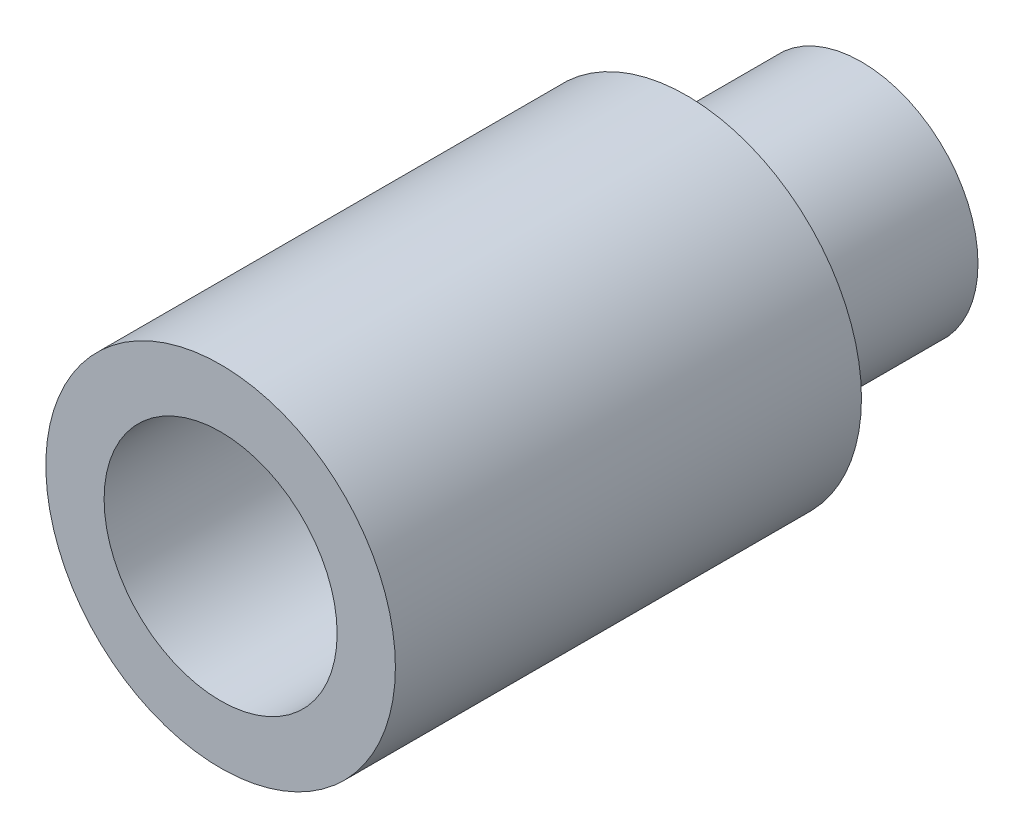
ISO-10303-21;
HEADER;
FILE_DESCRIPTION(('STEP AP214'),'2;1');
FILE_NAME('part.step','',(''),(''),'','','');
FILE_SCHEMA(('AUTOMOTIVE_DESIGN { 1 0 10303 214 1 1 1 1 }'));
ENDSEC;
DATA;
#1=APPLICATION_CONTEXT('core data for automotive mechanical design processes');
#2=APPLICATION_PROTOCOL_DEFINITION('international standard','automotive_design',2000,#1);
#3=PRODUCT_CONTEXT('',#1,'mechanical');
#4=PRODUCT('Part','Part','',(#3));
#5=PRODUCT_RELATED_PRODUCT_CATEGORY('part','',(#4));
#6=PRODUCT_DEFINITION_FORMATION('','',#4);
#7=PRODUCT_DEFINITION_CONTEXT('part definition',#1,'design');
#8=PRODUCT_DEFINITION('design','',#6,#7);
#9=PRODUCT_DEFINITION_SHAPE('','',#8);
#10=(LENGTH_UNIT() NAMED_UNIT(*) SI_UNIT(.MILLI.,.METRE.));
#11=(NAMED_UNIT(*) PLANE_ANGLE_UNIT() SI_UNIT($,.RADIAN.));
#12=(NAMED_UNIT(*) SI_UNIT($,.STERADIAN.) SOLID_ANGLE_UNIT());
#13=UNCERTAINTY_MEASURE_WITH_UNIT(LENGTH_MEASURE(1.E-05),#10,'distance_accuracy_value','');
#14=(GEOMETRIC_REPRESENTATION_CONTEXT(3) GLOBAL_UNCERTAINTY_ASSIGNED_CONTEXT((#13)) GLOBAL_UNIT_ASSIGNED_CONTEXT((#10,
#11,#12)) REPRESENTATION_CONTEXT('',''));
#15=CARTESIAN_POINT('',(0.,0.,0.));
#16=DIRECTION('',(0.,0.,1.));
#17=DIRECTION('',(1.,0.,0.));
#18=AXIS2_PLACEMENT_3D('',#15,#16,#17);
#19=CARTESIAN_POINT('',(0.,0.,9.525));
#20=DIRECTION('',(0.,0.,-1.));
#21=DIRECTION('',(-1.,0.,0.));
#22=AXIS2_PLACEMENT_3D('',#19,#20,#21);
#23=CYLINDRICAL_SURFACE('',#22,6.35);
#24=CARTESIAN_POINT('',(0.,0.,9.525));
#25=DIRECTION('',(0.,0.,1.));
#26=DIRECTION('',(1.,0.,0.));
#27=AXIS2_PLACEMENT_3D('',#24,#25,#26);
#28=CIRCLE('',#27,6.35);
#29=CARTESIAN_POINT('',(-6.35,0.,9.525));
#30=VERTEX_POINT('',#29);
#31=EDGE_CURVE('E10',#30,#30,#28,.T.);
#32=CARTESIAN_POINT('',(0.,0.,0.));
#33=DIRECTION('',(0.,0.,1.));
#34=DIRECTION('',(1.,0.,0.));
#35=AXIS2_PLACEMENT_3D('',#32,#33,#34);
#36=CIRCLE('',#35,6.35);
#37=CARTESIAN_POINT('',(-6.35,0.,0.));
#38=VERTEX_POINT('',#37);
#39=EDGE_CURVE('E34',#38,#38,#36,.T.);
#40=CARTESIAN_POINT('',(-6.35,0.,9.525));
#41=CARTESIAN_POINT('',(-6.35,0.,9.42578125));
#42=CARTESIAN_POINT('',(-6.35,0.,9.3265625));
#43=CARTESIAN_POINT('',(-6.35,0.,9.128125));
#44=CARTESIAN_POINT('',(-6.35,0.,9.02890625));
#45=CARTESIAN_POINT('',(-6.35,0.,8.83046875));
#46=CARTESIAN_POINT('',(-6.35,0.,8.73125));
#47=CARTESIAN_POINT('',(-6.35,0.,8.5328125));
#48=CARTESIAN_POINT('',(-6.35,0.,8.43359375));
#49=CARTESIAN_POINT('',(-6.35,0.,8.23515625));
#50=CARTESIAN_POINT('',(-6.35,0.,8.1359375));
#51=CARTESIAN_POINT('',(-6.35,0.,7.9375));
#52=CARTESIAN_POINT('',(-6.35,0.,7.83828125));
#53=CARTESIAN_POINT('',(-6.35,0.,7.63984375));
#54=CARTESIAN_POINT('',(-6.35,0.,7.540625));
#55=CARTESIAN_POINT('',(-6.35,0.,7.3421875));
#56=CARTESIAN_POINT('',(-6.35,0.,7.24296875));
#57=CARTESIAN_POINT('',(-6.35,0.,7.04453125));
#58=CARTESIAN_POINT('',(-6.35,0.,6.9453125));
#59=CARTESIAN_POINT('',(-6.35,0.,6.746875));
#60=CARTESIAN_POINT('',(-6.35,0.,6.64765625));
#61=CARTESIAN_POINT('',(-6.35,0.,6.44921875));
#62=CARTESIAN_POINT('',(-6.35,0.,6.35));
#63=CARTESIAN_POINT('',(-6.35,0.,6.1515625));
#64=CARTESIAN_POINT('',(-6.35,0.,6.05234375));
#65=CARTESIAN_POINT('',(-6.35,0.,5.85390625));
#66=CARTESIAN_POINT('',(-6.35,0.,5.7546875));
#67=CARTESIAN_POINT('',(-6.35,0.,5.55625));
#68=CARTESIAN_POINT('',(-6.35,0.,5.45703125));
#69=CARTESIAN_POINT('',(-6.35,0.,5.25859375));
#70=CARTESIAN_POINT('',(-6.35,0.,5.159375));
#71=CARTESIAN_POINT('',(-6.35,0.,4.9609375));
#72=CARTESIAN_POINT('',(-6.35,0.,4.86171875));
#73=CARTESIAN_POINT('',(-6.35,0.,4.66328125));
#74=CARTESIAN_POINT('',(-6.35,0.,4.5640625));
#75=CARTESIAN_POINT('',(-6.35,0.,4.365625));
#76=CARTESIAN_POINT('',(-6.35,0.,4.26640625));
#77=CARTESIAN_POINT('',(-6.35,0.,4.06796875));
#78=CARTESIAN_POINT('',(-6.35,0.,3.96875));
#79=CARTESIAN_POINT('',(-6.35,0.,3.7703125));
#80=CARTESIAN_POINT('',(-6.35,0.,3.67109375));
#81=CARTESIAN_POINT('',(-6.35,0.,3.47265625));
#82=CARTESIAN_POINT('',(-6.35,0.,3.3734375));
#83=CARTESIAN_POINT('',(-6.35,0.,3.175));
#84=CARTESIAN_POINT('',(-6.35,0.,3.07578125));
#85=CARTESIAN_POINT('',(-6.35,0.,2.87734375));
#86=CARTESIAN_POINT('',(-6.35,0.,2.778125));
#87=CARTESIAN_POINT('',(-6.35,0.,2.5796875));
#88=CARTESIAN_POINT('',(-6.35,0.,2.48046875));
#89=CARTESIAN_POINT('',(-6.35,0.,2.28203125));
#90=CARTESIAN_POINT('',(-6.35,0.,2.1828125));
#91=CARTESIAN_POINT('',(-6.35,0.,1.984375));
#92=CARTESIAN_POINT('',(-6.35,0.,1.88515625));
#93=CARTESIAN_POINT('',(-6.35,0.,1.68671875));
#94=CARTESIAN_POINT('',(-6.35,0.,1.5875));
#95=CARTESIAN_POINT('',(-6.35,0.,1.3890625));
#96=CARTESIAN_POINT('',(-6.35,0.,1.28984375));
#97=CARTESIAN_POINT('',(-6.35,0.,1.09140625));
#98=CARTESIAN_POINT('',(-6.35,0.,0.992187500000001));
#99=CARTESIAN_POINT('',(-6.35,0.,0.793750000000001));
#100=CARTESIAN_POINT('',(-6.35,0.,0.69453125));
#101=CARTESIAN_POINT('',(-6.35,0.,0.49609375));
#102=CARTESIAN_POINT('',(-6.35,0.,0.396875));
#103=CARTESIAN_POINT('',(-6.35,0.,0.1984375));
#104=CARTESIAN_POINT('',(-6.35,0.,0.0992187500000001));
#105=CARTESIAN_POINT('',(-6.35,0.,0.));
#106=B_SPLINE_CURVE_WITH_KNOTS('',3,(#40,#41,#42,#43,#44,#45,#46,#47,#48,#49,#50,#51,#52,#53,
#54,#55,#56,#57,#58,#59,#60,#61,#62,#63,#64,#65,#66,#67,#68,#69,#70,#71,#72,#73,#74,#75,#76,#77,
#78,#79,#80,#81,#82,#83,#84,#85,#86,#87,#88,#89,#90,#91,#92,#93,#94,#95,#96,#97,#98,#99,#100,
#101,#102,#103,#104,#105),.UNSPECIFIED.,.F.,.F.,(4,2,2,2,2,2,2,2,2,2,2,2,2,2,2,2,2,2,2,2,2,2,2,
2,2,2,2,2,2,2,2,2,4),(0.,0.297656249999998,0.595312499999999,0.892968749999999,1.190625,
1.48828125,1.7859375,2.08359375,2.38125,2.67890625,2.9765625,3.27421875,3.571875,3.86953125,
4.1671875,4.46484375,4.7625,5.06015625,5.3578125,5.65546875,5.953125,6.25078125,6.5484375,
6.84609375,7.14375,7.44140625,7.7390625,8.03671875,8.334375,8.63203125,8.9296875,9.22734375,
9.525),.UNSPECIFIED.);
#107=EDGE_CURVE('BSEAM31',#30,#38,#106,.T.);
#108=ORIENTED_EDGE('',*,*,#31,.F.);
#109=ORIENTED_EDGE('',*,*,#39,.T.);
#110=ORIENTED_EDGE('',*,*,#107,.T.);
#111=ORIENTED_EDGE('',*,*,#107,.F.);
#112=EDGE_LOOP('',(#108,#110,#109,#111));
#113=FACE_BOUND('',#112,.T.);
#114=ADVANCED_FACE('F31',(#113),#23,.T.);
#115=CARTESIAN_POINT('',(0.,0.,0.));
#116=DIRECTION('',(0.,0.,1.));
#117=DIRECTION('',(1.,0.,0.));
#118=AXIS2_PLACEMENT_3D('',#115,#116,#117);
#119=PLANE('',#118);
#120=ORIENTED_EDGE('',*,*,#39,.F.);
#121=EDGE_LOOP('',(#120));
#122=FACE_BOUND('',#121,.T.);
#123=ADVANCED_FACE('F73',(#122),#119,.F.);
#124=CARTESIAN_POINT('',(0.,0.,34.925));
#125=DIRECTION('',(0.,0.,-1.));
#126=DIRECTION('',(-1.,0.,0.));
#127=AXIS2_PLACEMENT_3D('',#124,#125,#126);
#128=CYLINDRICAL_SURFACE('',#127,9.525);
#129=CARTESIAN_POINT('',(0.,0.,34.925));
#130=DIRECTION('',(0.,0.,1.));
#131=DIRECTION('',(1.,0.,0.));
#132=AXIS2_PLACEMENT_3D('',#129,#130,#131);
#133=CIRCLE('',#132,9.525);
#134=CARTESIAN_POINT('',(9.525,0.,34.925));
#135=VERTEX_POINT('',#134);
#136=EDGE_CURVE('E41',#135,#135,#133,.T.);
#137=ORIENTED_EDGE('',*,*,#136,.F.);
#138=EDGE_LOOP('',(#137));
#139=FACE_BOUND('',#138,.T.);
#140=CARTESIAN_POINT('',(0.,0.,9.525));
#141=DIRECTION('',(0.,0.,1.));
#142=DIRECTION('',(1.,0.,0.));
#143=AXIS2_PLACEMENT_3D('',#140,#141,#142);
#144=CIRCLE('',#143,9.525);
#145=CARTESIAN_POINT('',(9.525,0.,9.525));
#146=VERTEX_POINT('',#145);
#147=EDGE_CURVE('E43',#146,#146,#144,.T.);
#148=ORIENTED_EDGE('',*,*,#147,.T.);
#149=EDGE_LOOP('',(#148));
#150=FACE_BOUND('',#149,.T.);
#151=ADVANCED_FACE('F67',(#139,#150),#128,.T.);
#152=CARTESIAN_POINT('',(0.,0.,34.925));
#153=DIRECTION('',(0.,0.,1.));
#154=DIRECTION('',(1.,0.,0.));
#155=AXIS2_PLACEMENT_3D('',#152,#153,#154);
#156=PLANE('',#155);
#157=CARTESIAN_POINT('',(0.,0.,34.925));
#158=DIRECTION('',(0.,0.,1.));
#159=DIRECTION('',(1.,0.,0.));
#160=AXIS2_PLACEMENT_3D('',#157,#158,#159);
#161=CIRCLE('',#160,6.35);
#162=CARTESIAN_POINT('',(6.35,0.,34.925));
#163=VERTEX_POINT('',#162);
#164=EDGE_CURVE('E49',#163,#163,#161,.T.);
#165=ORIENTED_EDGE('',*,*,#164,.F.);
#166=EDGE_LOOP('',(#165));
#167=FACE_BOUND('',#166,.T.);
#168=ORIENTED_EDGE('',*,*,#136,.T.);
#169=EDGE_LOOP('',(#168));
#170=FACE_BOUND('',#169,.T.);
#171=ADVANCED_FACE('F64',(#167,#170),#156,.T.);
#172=CARTESIAN_POINT('',(0.,0.,9.525));
#173=DIRECTION('',(0.,0.,1.));
#174=DIRECTION('',(1.,0.,0.));
#175=AXIS2_PLACEMENT_3D('',#172,#173,#174);
#176=PLANE('',#175);
#177=ORIENTED_EDGE('',*,*,#31,.T.);
#178=EDGE_LOOP('',(#177));
#179=FACE_BOUND('',#178,.T.);
#180=ORIENTED_EDGE('',*,*,#147,.F.);
#181=EDGE_LOOP('',(#180));
#182=FACE_BOUND('',#181,.T.);
#183=ADVANCED_FACE('F60',(#179,#182),#176,.F.);
#184=CARTESIAN_POINT('',(0.,0.,15.875));
#185=DIRECTION('',(0.,0.,1.));
#186=DIRECTION('',(1.,0.,0.));
#187=AXIS2_PLACEMENT_3D('',#184,#185,#186);
#188=CYLINDRICAL_SURFACE('',#187,6.35);
#189=CARTESIAN_POINT('',(0.,0.,15.875));
#190=DIRECTION('',(0.,0.,1.));
#191=DIRECTION('',(1.,0.,0.));
#192=AXIS2_PLACEMENT_3D('',#189,#190,#191);
#193=CIRCLE('',#192,6.35);
#194=CARTESIAN_POINT('',(6.35,0.,15.875));
#195=VERTEX_POINT('',#194);
#196=EDGE_CURVE('E46',#195,#195,#193,.T.);
#197=CARTESIAN_POINT('',(6.35,0.,15.875));
#198=CARTESIAN_POINT('',(6.35,0.,16.0734375));
#199=CARTESIAN_POINT('',(6.35,0.,16.271875));
#200=CARTESIAN_POINT('',(6.35,0.,16.66875));
#201=CARTESIAN_POINT('',(6.35,0.,16.8671875));
#202=CARTESIAN_POINT('',(6.35,0.,17.2640625));
#203=CARTESIAN_POINT('',(6.35,0.,17.4625));
#204=CARTESIAN_POINT('',(6.35,0.,17.859375));
#205=CARTESIAN_POINT('',(6.35,0.,18.0578125));
#206=CARTESIAN_POINT('',(6.35,0.,18.4546875));
#207=CARTESIAN_POINT('',(6.35,0.,18.653125));
#208=CARTESIAN_POINT('',(6.35,0.,19.05));
#209=CARTESIAN_POINT('',(6.35,0.,19.2484375));
#210=CARTESIAN_POINT('',(6.35,0.,19.6453125));
#211=CARTESIAN_POINT('',(6.35,0.,19.84375));
#212=CARTESIAN_POINT('',(6.35,0.,20.240625));
#213=CARTESIAN_POINT('',(6.35,0.,20.4390625));
#214=CARTESIAN_POINT('',(6.35,0.,20.8359375));
#215=CARTESIAN_POINT('',(6.35,0.,21.034375));
#216=CARTESIAN_POINT('',(6.35,0.,21.43125));
#217=CARTESIAN_POINT('',(6.35,0.,21.6296875));
#218=CARTESIAN_POINT('',(6.35,0.,22.0265625));
#219=CARTESIAN_POINT('',(6.35,0.,22.225));
#220=CARTESIAN_POINT('',(6.35,0.,22.621875));
#221=CARTESIAN_POINT('',(6.35,0.,22.8203125));
#222=CARTESIAN_POINT('',(6.35,0.,23.2171875));
#223=CARTESIAN_POINT('',(6.35,0.,23.415625));
#224=CARTESIAN_POINT('',(6.35,0.,23.8125));
#225=CARTESIAN_POINT('',(6.35,0.,24.0109375));
#226=CARTESIAN_POINT('',(6.35,0.,24.4078125));
#227=CARTESIAN_POINT('',(6.35,0.,24.60625));
#228=CARTESIAN_POINT('',(6.35,0.,25.003125));
#229=CARTESIAN_POINT('',(6.35,0.,25.2015625));
#230=CARTESIAN_POINT('',(6.35,0.,25.5984375));
#231=CARTESIAN_POINT('',(6.35,0.,25.796875));
#232=CARTESIAN_POINT('',(6.35,0.,26.19375));
#233=CARTESIAN_POINT('',(6.35,0.,26.3921875));
#234=CARTESIAN_POINT('',(6.35,0.,26.7890625));
#235=CARTESIAN_POINT('',(6.35,0.,26.9875));
#236=CARTESIAN_POINT('',(6.35,0.,27.384375));
#237=CARTESIAN_POINT('',(6.35,0.,27.5828125));
#238=CARTESIAN_POINT('',(6.35,0.,27.9796875));
#239=CARTESIAN_POINT('',(6.35,0.,28.178125));
#240=CARTESIAN_POINT('',(6.35,0.,28.575));
#241=CARTESIAN_POINT('',(6.35,0.,28.7734375));
#242=CARTESIAN_POINT('',(6.35,0.,29.1703125));
#243=CARTESIAN_POINT('',(6.35,0.,29.36875));
#244=CARTESIAN_POINT('',(6.35,0.,29.765625));
#245=CARTESIAN_POINT('',(6.35,0.,29.9640625));
#246=CARTESIAN_POINT('',(6.35,0.,30.3609375));
#247=CARTESIAN_POINT('',(6.35,0.,30.559375));
#248=CARTESIAN_POINT('',(6.35,0.,30.95625));
#249=CARTESIAN_POINT('',(6.35,0.,31.1546875));
#250=CARTESIAN_POINT('',(6.35,0.,31.5515625));
#251=CARTESIAN_POINT('',(6.35,0.,31.75));
#252=CARTESIAN_POINT('',(6.35,0.,32.146875));
#253=CARTESIAN_POINT('',(6.35,0.,32.3453125));
#254=CARTESIAN_POINT('',(6.35,0.,32.7421875));
#255=CARTESIAN_POINT('',(6.35,0.,32.940625));
#256=CARTESIAN_POINT('',(6.35,0.,33.3375));
#257=CARTESIAN_POINT('',(6.35,0.,33.5359375));
#258=CARTESIAN_POINT('',(6.35,0.,33.9328125));
#259=CARTESIAN_POINT('',(6.35,0.,34.13125));
#260=CARTESIAN_POINT('',(6.35,0.,34.528125));
#261=CARTESIAN_POINT('',(6.35,0.,34.7265625));
#262=CARTESIAN_POINT('',(6.35,0.,34.925));
#263=B_SPLINE_CURVE_WITH_KNOTS('',3,(#197,#198,#199,#200,#201,#202,#203,#204,#205,#206,#207,
#208,#209,#210,#211,#212,#213,#214,#215,#216,#217,#218,#219,#220,#221,#222,#223,#224,#225,#226,
#227,#228,#229,#230,#231,#232,#233,#234,#235,#236,#237,#238,#239,#240,#241,#242,#243,#244,#245,
#246,#247,#248,#249,#250,#251,#252,#253,#254,#255,#256,#257,#258,#259,#260,#261,#262),
.UNSPECIFIED.,.F.,.F.,(4,2,2,2,2,2,2,2,2,2,2,2,2,2,2,2,2,2,2,2,2,2,2,2,2,2,2,2,2,2,2,2,4),(0.,
0.595312499999997,1.190625,1.7859375,2.38125,2.9765625,3.571875,4.1671875,4.7625,5.3578125,
5.953125,6.5484375,7.14375,7.7390625,8.33437499999999,8.92968749999999,9.525,10.1203125,
10.715625,11.3109375,11.90625,12.5015625,13.096875,13.6921875,14.2875,14.8828125,15.478125,
16.0734375,16.66875,17.2640625,17.859375,18.4546875,19.05),.UNSPECIFIED.);
#264=EDGE_CURVE('BSEAM57',#195,#163,#263,.T.);
#265=ORIENTED_EDGE('',*,*,#196,.F.);
#266=ORIENTED_EDGE('',*,*,#164,.T.);
#267=ORIENTED_EDGE('',*,*,#264,.T.);
#268=ORIENTED_EDGE('',*,*,#264,.F.);
#269=EDGE_LOOP('',(#265,#267,#266,#268));
#270=FACE_BOUND('',#269,.T.);
#271=ADVANCED_FACE('F57',(#270),#188,.F.);
#272=CARTESIAN_POINT('',(0.,0.,15.875));
#273=DIRECTION('',(0.,0.,1.));
#274=DIRECTION('',(1.,0.,0.));
#275=AXIS2_PLACEMENT_3D('',#272,#273,#274);
#276=PLANE('',#275);
#277=ORIENTED_EDGE('',*,*,#196,.T.);
#278=EDGE_LOOP('',(#277));
#279=FACE_BOUND('',#278,.T.);
#280=ADVANCED_FACE('F55',(#279),#276,.T.);
#281=CLOSED_SHELL('',(#114,#123,#151,#171,#183,#271,#280));
#282=MANIFOLD_SOLID_BREP('B2',#281);
#283=ADVANCED_BREP_SHAPE_REPRESENTATION('',(#18,#282),#14);
#284=SHAPE_DEFINITION_REPRESENTATION(#9,#283);
ENDSEC;
END-ISO-10303-21;
